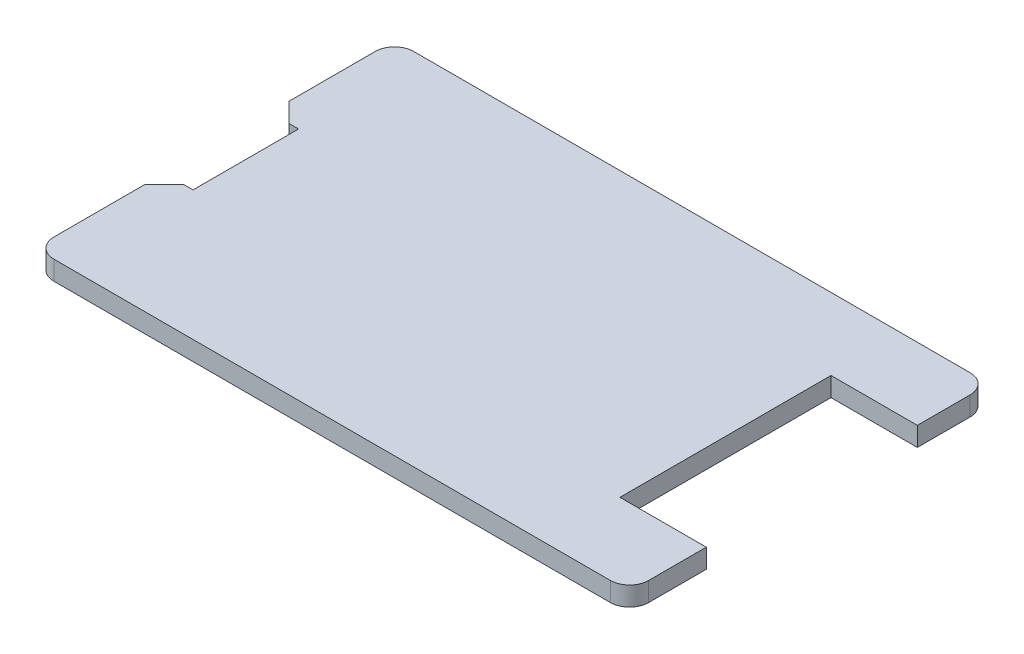
ISO-10303-21;
HEADER;
FILE_DESCRIPTION(('STEP AP214'),'2;1');
FILE_NAME('part.step','',(''),(''),'','','');
FILE_SCHEMA(('AUTOMOTIVE_DESIGN { 1 0 10303 214 1 1 1 1 }'));
ENDSEC;
DATA;
#1=APPLICATION_CONTEXT('core data for automotive mechanical design processes');
#2=APPLICATION_PROTOCOL_DEFINITION('international standard','automotive_design',2000,#1);
#3=PRODUCT_CONTEXT('',#1,'mechanical');
#4=PRODUCT('Part','Part','',(#3));
#5=PRODUCT_RELATED_PRODUCT_CATEGORY('part','',(#4));
#6=PRODUCT_DEFINITION_FORMATION('','',#4);
#7=PRODUCT_DEFINITION_CONTEXT('part definition',#1,'design');
#8=PRODUCT_DEFINITION('design','',#6,#7);
#9=PRODUCT_DEFINITION_SHAPE('','',#8);
#10=(LENGTH_UNIT() NAMED_UNIT(*) SI_UNIT(.MILLI.,.METRE.));
#11=(NAMED_UNIT(*) PLANE_ANGLE_UNIT() SI_UNIT($,.RADIAN.));
#12=(NAMED_UNIT(*) SI_UNIT($,.STERADIAN.) SOLID_ANGLE_UNIT());
#13=UNCERTAINTY_MEASURE_WITH_UNIT(LENGTH_MEASURE(1.E-05),#10,'distance_accuracy_value','');
#14=(GEOMETRIC_REPRESENTATION_CONTEXT(3) GLOBAL_UNCERTAINTY_ASSIGNED_CONTEXT((#13)) GLOBAL_UNIT_ASSIGNED_CONTEXT((#10,
#11,#12)) REPRESENTATION_CONTEXT('',''));
#15=CARTESIAN_POINT('',(0.,0.,0.));
#16=DIRECTION('',(0.,0.,1.));
#17=DIRECTION('',(1.,0.,0.));
#18=AXIS2_PLACEMENT_3D('',#15,#16,#17);
#19=CARTESIAN_POINT('',(30.75,2.,22.8489425981873));
#20=DIRECTION('',(-1.,0.,0.));
#21=DIRECTION('',(0.,0.,1.));
#22=AXIS2_PLACEMENT_3D('',#19,#20,#21);
#23=PLANE('',#22);
#24=DIRECTION('',(0.,0.,-1.));
#25=VECTOR('',#24,1.);
#26=CARTESIAN_POINT('',(30.75,0.,22.8489425981873));
#27=LINE('',#26,#25);
#28=CARTESIAN_POINT('',(30.75,0.,22.8489425981873));
#29=VERTEX_POINT('',#28);
#30=CARTESIAN_POINT('',(30.75,0.,16.8489425981873));
#31=VERTEX_POINT('',#30);
#32=EDGE_CURVE('E184',#29,#31,#27,.T.);
#33=ORIENTED_EDGE('',*,*,#32,.T.);
#34=DIRECTION('',(0.,1.,0.));
#35=VECTOR('',#34,1.);
#36=CARTESIAN_POINT('',(30.75,0.,16.8489425981873));
#37=LINE('',#36,#35);
#38=CARTESIAN_POINT('',(30.75,2.,16.8489425981873));
#39=VERTEX_POINT('',#38);
#40=EDGE_CURVE('E275',#31,#39,#37,.T.);
#41=ORIENTED_EDGE('',*,*,#40,.T.);
#42=DIRECTION('',(0.,0.,-1.));
#43=VECTOR('',#42,1.);
#44=CARTESIAN_POINT('',(30.75,2.,22.8489425981873));
#45=LINE('',#44,#43);
#46=CARTESIAN_POINT('',(30.75,2.,22.8489425981873));
#47=VERTEX_POINT('',#46);
#48=EDGE_CURVE('E276',#47,#39,#45,.T.);
#49=ORIENTED_EDGE('',*,*,#48,.F.);
#50=DIRECTION('',(0.,-1.,0.));
#51=VECTOR('',#50,1.);
#52=CARTESIAN_POINT('',(30.75,2.,22.8489425981873));
#53=LINE('',#52,#51);
#54=EDGE_CURVE('E216',#47,#29,#53,.T.);
#55=ORIENTED_EDGE('',*,*,#54,.T.);
#56=EDGE_LOOP('',(#33,#41,#49,#55));
#57=FACE_BOUND('',#56,.T.);
#58=ADVANCED_FACE('F35',(#57),#23,.F.);
#59=CARTESIAN_POINT('',(-31.25,2.,22.8489425981873));
#60=DIRECTION('',(1.,0.,0.));
#61=DIRECTION('',(0.,0.,-1.));
#62=AXIS2_PLACEMENT_3D('',#59,#60,#61);
#63=PLANE('',#62);
#64=DIRECTION('',(0.,0.,1.));
#65=VECTOR('',#64,1.);
#66=CARTESIAN_POINT('',(-31.25,0.,22.8489425981873));
#67=LINE('',#66,#65);
#68=CARTESIAN_POINT('',(-31.25,0.,-10.6510574018127));
#69=VERTEX_POINT('',#68);
#70=CARTESIAN_POINT('',(-31.25,0.,-1.6510574018127));
#71=VERTEX_POINT('',#70);
#72=EDGE_CURVE('E198',#69,#71,#67,.T.);
#73=ORIENTED_EDGE('',*,*,#72,.T.);
#74=DIRECTION('',(0.,1.,0.));
#75=VECTOR('',#74,1.);
#76=CARTESIAN_POINT('',(-31.25,2.,-1.6510574018127));
#77=LINE('',#76,#75);
#78=CARTESIAN_POINT('',(-31.25,2.,-1.6510574018127));
#79=VERTEX_POINT('',#78);
#80=EDGE_CURVE('E43',#71,#79,#77,.T.);
#81=ORIENTED_EDGE('',*,*,#80,.T.);
#82=DIRECTION('',(0.,0.,1.));
#83=VECTOR('',#82,1.);
#84=CARTESIAN_POINT('',(-31.25,2.,22.8489425981873));
#85=LINE('',#84,#83);
#86=CARTESIAN_POINT('',(-31.25,2.,-10.6510574018127));
#87=VERTEX_POINT('',#86);
#88=EDGE_CURVE('E205',#87,#79,#85,.T.);
#89=ORIENTED_EDGE('',*,*,#88,.F.);
#90=DIRECTION('',(0.,-1.,0.));
#91=VECTOR('',#90,1.);
#92=CARTESIAN_POINT('',(-31.25,2.,-10.6510574018127));
#93=LINE('',#92,#91);
#94=EDGE_CURVE('E204',#87,#69,#93,.T.);
#95=ORIENTED_EDGE('',*,*,#94,.T.);
#96=EDGE_LOOP('',(#73,#81,#89,#95));
#97=FACE_BOUND('',#96,.T.);
#98=ADVANCED_FACE('F241',(#97),#63,.F.);
#99=CARTESIAN_POINT('',(-29.25,2.,22.8489425981873));
#100=DIRECTION('',(0.,-1.,0.));
#101=DIRECTION('',(0.,0.,-1.));
#102=AXIS2_PLACEMENT_3D('',#99,#100,#101);
#103=CYLINDRICAL_SURFACE('',#102,2.);
#104=CARTESIAN_POINT('',(-29.25,0.,22.8489425981873));
#105=DIRECTION('',(0.,1.,0.));
#106=DIRECTION('',(0.,0.,-1.));
#107=AXIS2_PLACEMENT_3D('',#104,#105,#106);
#108=CIRCLE('',#107,2.);
#109=CARTESIAN_POINT('',(-31.25,0.,22.8489425981873));
#110=VERTEX_POINT('',#109);
#111=CARTESIAN_POINT('',(-29.25,0.,24.8489425981873));
#112=VERTEX_POINT('',#111);
#113=EDGE_CURVE('E256',#110,#112,#108,.T.);
#114=ORIENTED_EDGE('',*,*,#113,.T.);
#115=DIRECTION('',(0.,-1.,0.));
#116=VECTOR('',#115,1.);
#117=CARTESIAN_POINT('',(-29.25,2.,24.8489425981873));
#118=LINE('',#117,#116);
#119=CARTESIAN_POINT('',(-29.25,2.,24.8489425981873));
#120=VERTEX_POINT('',#119);
#121=EDGE_CURVE('E222',#120,#112,#118,.T.);
#122=ORIENTED_EDGE('',*,*,#121,.F.);
#123=CARTESIAN_POINT('',(-29.25,2.,22.8489425981873));
#124=DIRECTION('',(0.,1.,0.));
#125=DIRECTION('',(0.,0.,-1.));
#126=AXIS2_PLACEMENT_3D('',#123,#124,#125);
#127=CIRCLE('',#126,2.);
#128=CARTESIAN_POINT('',(-31.25,2.,22.8489425981873));
#129=VERTEX_POINT('',#128);
#130=EDGE_CURVE('E200',#129,#120,#127,.T.);
#131=ORIENTED_EDGE('',*,*,#130,.F.);
#132=DIRECTION('',(0.,-1.,0.));
#133=VECTOR('',#132,1.);
#134=CARTESIAN_POINT('',(-31.25,2.,22.8489425981873));
#135=LINE('',#134,#133);
#136=EDGE_CURVE('E201',#129,#110,#135,.T.);
#137=ORIENTED_EDGE('',*,*,#136,.T.);
#138=EDGE_LOOP('',(#114,#122,#131,#137));
#139=FACE_BOUND('',#138,.T.);
#140=ADVANCED_FACE('F309',(#139),#103,.T.);
#141=CARTESIAN_POINT('',(-29.25,2.,24.8489425981873));
#142=DIRECTION('',(0.,0.,-1.));
#143=DIRECTION('',(-1.,0.,0.));
#144=AXIS2_PLACEMENT_3D('',#141,#142,#143);
#145=PLANE('',#144);
#146=DIRECTION('',(1.,0.,0.));
#147=VECTOR('',#146,1.);
#148=CARTESIAN_POINT('',(-29.25,0.,24.8489425981873));
#149=LINE('',#148,#147);
#150=CARTESIAN_POINT('',(28.75,0.,24.8489425981873));
#151=VERTEX_POINT('',#150);
#152=EDGE_CURVE('E188',#112,#151,#149,.T.);
#153=ORIENTED_EDGE('',*,*,#152,.T.);
#154=DIRECTION('',(0.,-1.,0.));
#155=VECTOR('',#154,1.);
#156=CARTESIAN_POINT('',(28.75,2.,24.8489425981873));
#157=LINE('',#156,#155);
#158=CARTESIAN_POINT('',(28.75,2.,24.8489425981873));
#159=VERTEX_POINT('',#158);
#160=EDGE_CURVE('E219',#159,#151,#157,.T.);
#161=ORIENTED_EDGE('',*,*,#160,.F.);
#162=DIRECTION('',(1.,0.,0.));
#163=VECTOR('',#162,1.);
#164=CARTESIAN_POINT('',(-29.25,2.,24.8489425981873));
#165=LINE('',#164,#163);
#166=EDGE_CURVE('E366',#120,#159,#165,.T.);
#167=ORIENTED_EDGE('',*,*,#166,.F.);
#168=ORIENTED_EDGE('',*,*,#121,.T.);
#169=EDGE_LOOP('',(#153,#161,#167,#168));
#170=FACE_BOUND('',#169,.T.);
#171=ADVANCED_FACE('F261',(#170),#145,.F.);
#172=CARTESIAN_POINT('',(28.75,2.,22.8489425981873));
#173=DIRECTION('',(0.,-1.,0.));
#174=DIRECTION('',(0.,0.,-1.));
#175=AXIS2_PLACEMENT_3D('',#172,#173,#174);
#176=CYLINDRICAL_SURFACE('',#175,2.);
#177=CARTESIAN_POINT('',(28.75,0.,22.8489425981873));
#178=DIRECTION('',(0.,1.,0.));
#179=DIRECTION('',(0.,0.,1.));
#180=AXIS2_PLACEMENT_3D('',#177,#178,#179);
#181=CIRCLE('',#180,2.);
#182=EDGE_CURVE('E185',#151,#29,#181,.T.);
#183=ORIENTED_EDGE('',*,*,#182,.T.);
#184=ORIENTED_EDGE('',*,*,#54,.F.);
#185=CARTESIAN_POINT('',(28.75,2.,22.8489425981873));
#186=DIRECTION('',(0.,1.,0.));
#187=DIRECTION('',(0.,0.,1.));
#188=AXIS2_PLACEMENT_3D('',#185,#186,#187);
#189=CIRCLE('',#188,2.);
#190=EDGE_CURVE('E269',#159,#47,#189,.T.);
#191=ORIENTED_EDGE('',*,*,#190,.F.);
#192=ORIENTED_EDGE('',*,*,#160,.T.);
#193=EDGE_LOOP('',(#183,#184,#191,#192));
#194=FACE_BOUND('',#193,.T.);
#195=ADVANCED_FACE('F267',(#194),#176,.T.);
#196=CARTESIAN_POINT('',(30.75,2.,-5.15105740181269));
#197=VERTEX_POINT('',#196);
#198=CARTESIAN_POINT('',(30.75,2.,-10.6510574018127));
#199=VERTEX_POINT('',#198);
#200=EDGE_CURVE('E176',#197,#199,#45,.T.);
#201=ORIENTED_EDGE('',*,*,#200,.F.);
#202=DIRECTION('',(0.,1.,0.));
#203=VECTOR('',#202,1.);
#204=CARTESIAN_POINT('',(30.75,0.,-5.15105740181269));
#205=LINE('',#204,#203);
#206=CARTESIAN_POINT('',(30.75,0.,-5.15105740181269));
#207=VERTEX_POINT('',#206);
#208=EDGE_CURVE('E164',#207,#197,#205,.T.);
#209=ORIENTED_EDGE('',*,*,#208,.F.);
#210=CARTESIAN_POINT('',(30.75,0.,-10.6510574018127));
#211=VERTEX_POINT('',#210);
#212=EDGE_CURVE('E174',#207,#211,#27,.T.);
#213=ORIENTED_EDGE('',*,*,#212,.T.);
#214=DIRECTION('',(0.,-1.,0.));
#215=VECTOR('',#214,1.);
#216=CARTESIAN_POINT('',(30.75,2.,-10.6510574018127));
#217=LINE('',#216,#215);
#218=EDGE_CURVE('E214',#199,#211,#217,.T.);
#219=ORIENTED_EDGE('',*,*,#218,.F.);
#220=EDGE_LOOP('',(#201,#209,#213,#219));
#221=FACE_BOUND('',#220,.T.);
#222=ADVANCED_FACE('F172',(#221),#23,.F.);
#223=CARTESIAN_POINT('',(28.75,2.,-10.6510574018127));
#224=DIRECTION('',(0.,-1.,0.));
#225=DIRECTION('',(0.,0.,-1.));
#226=AXIS2_PLACEMENT_3D('',#223,#224,#225);
#227=CYLINDRICAL_SURFACE('',#226,2.);
#228=CARTESIAN_POINT('',(28.75,0.,-10.6510574018127));
#229=DIRECTION('',(0.,1.,0.));
#230=DIRECTION('',(0.,0.,-1.));
#231=AXIS2_PLACEMENT_3D('',#228,#229,#230);
#232=CIRCLE('',#231,2.);
#233=CARTESIAN_POINT('',(28.75,0.,-12.6510574018127));
#234=VERTEX_POINT('',#233);
#235=EDGE_CURVE('E183',#211,#234,#232,.T.);
#236=ORIENTED_EDGE('',*,*,#235,.T.);
#237=DIRECTION('',(0.,-1.,0.));
#238=VECTOR('',#237,1.);
#239=CARTESIAN_POINT('',(28.75,2.,-12.6510574018127));
#240=LINE('',#239,#238);
#241=CARTESIAN_POINT('',(28.75,2.,-12.6510574018127));
#242=VERTEX_POINT('',#241);
#243=EDGE_CURVE('E211',#242,#234,#240,.T.);
#244=ORIENTED_EDGE('',*,*,#243,.F.);
#245=CARTESIAN_POINT('',(28.75,2.,-10.6510574018127));
#246=DIRECTION('',(0.,1.,0.));
#247=DIRECTION('',(0.,0.,-1.));
#248=AXIS2_PLACEMENT_3D('',#245,#246,#247);
#249=CIRCLE('',#248,2.);
#250=EDGE_CURVE('E278',#199,#242,#249,.T.);
#251=ORIENTED_EDGE('',*,*,#250,.F.);
#252=ORIENTED_EDGE('',*,*,#218,.T.);
#253=EDGE_LOOP('',(#236,#244,#251,#252));
#254=FACE_BOUND('',#253,.T.);
#255=ADVANCED_FACE('F302',(#254),#227,.T.);
#256=CARTESIAN_POINT('',(-29.25,2.,-12.6510574018127));
#257=DIRECTION('',(0.,0.,1.));
#258=DIRECTION('',(1.,0.,0.));
#259=AXIS2_PLACEMENT_3D('',#256,#257,#258);
#260=PLANE('',#259);
#261=DIRECTION('',(-1.,0.,0.));
#262=VECTOR('',#261,1.);
#263=CARTESIAN_POINT('',(-29.25,0.,-12.6510574018127));
#264=LINE('',#263,#262);
#265=CARTESIAN_POINT('',(-29.25,0.,-12.6510574018127));
#266=VERTEX_POINT('',#265);
#267=EDGE_CURVE('E193',#234,#266,#264,.T.);
#268=ORIENTED_EDGE('',*,*,#267,.T.);
#269=DIRECTION('',(0.,-1.,0.));
#270=VECTOR('',#269,1.);
#271=CARTESIAN_POINT('',(-29.25,2.,-12.6510574018127));
#272=LINE('',#271,#270);
#273=CARTESIAN_POINT('',(-29.25,2.,-12.6510574018127));
#274=VERTEX_POINT('',#273);
#275=EDGE_CURVE('E208',#274,#266,#272,.T.);
#276=ORIENTED_EDGE('',*,*,#275,.F.);
#277=DIRECTION('',(-1.,0.,0.));
#278=VECTOR('',#277,1.);
#279=CARTESIAN_POINT('',(-29.25,2.,-12.6510574018127));
#280=LINE('',#279,#278);
#281=EDGE_CURVE('E280',#242,#274,#280,.T.);
#282=ORIENTED_EDGE('',*,*,#281,.F.);
#283=ORIENTED_EDGE('',*,*,#243,.T.);
#284=EDGE_LOOP('',(#268,#276,#282,#283));
#285=FACE_BOUND('',#284,.T.);
#286=ADVANCED_FACE('F289',(#285),#260,.F.);
#287=CARTESIAN_POINT('',(-29.25,2.,-10.6510574018127));
#288=DIRECTION('',(0.,-1.,0.));
#289=DIRECTION('',(0.,0.,-1.));
#290=AXIS2_PLACEMENT_3D('',#287,#288,#289);
#291=CYLINDRICAL_SURFACE('',#290,2.);
#292=CARTESIAN_POINT('',(-29.25,0.,-10.6510574018127));
#293=DIRECTION('',(0.,1.,0.));
#294=DIRECTION('',(0.,0.,-1.));
#295=AXIS2_PLACEMENT_3D('',#292,#293,#294);
#296=CIRCLE('',#295,2.);
#297=EDGE_CURVE('E195',#266,#69,#296,.T.);
#298=ORIENTED_EDGE('',*,*,#297,.T.);
#299=ORIENTED_EDGE('',*,*,#94,.F.);
#300=CARTESIAN_POINT('',(-29.25,2.,-10.6510574018127));
#301=DIRECTION('',(0.,1.,0.));
#302=DIRECTION('',(0.,0.,-1.));
#303=AXIS2_PLACEMENT_3D('',#300,#301,#302);
#304=CIRCLE('',#303,2.);
#305=EDGE_CURVE('E249',#274,#87,#304,.T.);
#306=ORIENTED_EDGE('',*,*,#305,.F.);
#307=ORIENTED_EDGE('',*,*,#275,.T.);
#308=EDGE_LOOP('',(#298,#299,#306,#307));
#309=FACE_BOUND('',#308,.T.);
#310=ADVANCED_FACE('F292',(#309),#291,.T.);
#311=CARTESIAN_POINT('',(-31.25,2.,13.3489425981873));
#312=VERTEX_POINT('',#311);
#313=EDGE_CURVE('E251',#312,#129,#85,.T.);
#314=ORIENTED_EDGE('',*,*,#313,.F.);
#315=DIRECTION('',(0.,-1.,0.));
#316=VECTOR('',#315,1.);
#317=CARTESIAN_POINT('',(-31.25,2.,13.3489425981873));
#318=LINE('',#317,#316);
#319=CARTESIAN_POINT('',(-31.25,0.,13.3489425981873));
#320=VERTEX_POINT('',#319);
#321=EDGE_CURVE('E232',#312,#320,#318,.T.);
#322=ORIENTED_EDGE('',*,*,#321,.T.);
#323=EDGE_CURVE('E197',#320,#110,#67,.T.);
#324=ORIENTED_EDGE('',*,*,#323,.T.);
#325=ORIENTED_EDGE('',*,*,#136,.F.);
#326=EDGE_LOOP('',(#314,#322,#324,#325));
#327=FACE_BOUND('',#326,.T.);
#328=ADVANCED_FACE('F294',(#327),#63,.F.);
#329=CARTESIAN_POINT('',(-29.25,2.,22.8489425981873));
#330=DIRECTION('',(0.,-1.,0.));
#331=DIRECTION('',(0.,0.,-1.));
#332=AXIS2_PLACEMENT_3D('',#329,#330,#331);
#333=PLANE('',#332);
#334=ORIENTED_EDGE('',*,*,#48,.T.);
#335=DIRECTION('',(1.,0.,0.));
#336=VECTOR('',#335,1.);
#337=CARTESIAN_POINT('',(30.75,2.,16.8489425981873));
#338=LINE('',#337,#336);
#339=CARTESIAN_POINT('',(21.75,2.,16.8489425981873));
#340=VERTEX_POINT('',#339);
#341=EDGE_CURVE('E168',#340,#39,#338,.T.);
#342=ORIENTED_EDGE('',*,*,#341,.F.);
#343=DIRECTION('',(0.,0.,1.));
#344=VECTOR('',#343,1.);
#345=CARTESIAN_POINT('',(21.75,2.,-5.15105740181269));
#346=LINE('',#345,#344);
#347=CARTESIAN_POINT('',(21.75,2.,-5.15105740181269));
#348=VERTEX_POINT('',#347);
#349=EDGE_CURVE('E428',#348,#340,#346,.T.);
#350=ORIENTED_EDGE('',*,*,#349,.F.);
#351=DIRECTION('',(-1.,0.,0.));
#352=VECTOR('',#351,1.);
#353=CARTESIAN_POINT('',(30.75,2.,-5.15105740181269));
#354=LINE('',#353,#352);
#355=EDGE_CURVE('E430',#197,#348,#354,.T.);
#356=ORIENTED_EDGE('',*,*,#355,.F.);
#357=ORIENTED_EDGE('',*,*,#200,.T.);
#358=ORIENTED_EDGE('',*,*,#250,.T.);
#359=ORIENTED_EDGE('',*,*,#281,.T.);
#360=ORIENTED_EDGE('',*,*,#305,.T.);
#361=ORIENTED_EDGE('',*,*,#88,.T.);
#362=DIRECTION('',(-0.707106781186548,0.,-0.707106781186547));
#363=VECTOR('',#362,1.);
#364=CARTESIAN_POINT('',(-31.25,2.,-1.6510574018127));
#365=LINE('',#364,#363);
#366=CARTESIAN_POINT('',(-29.25,2.,0.348942598187308));
#367=VERTEX_POINT('',#366);
#368=EDGE_CURVE('E228',#79,#367,#365,.F.);
#369=ORIENTED_EDGE('',*,*,#368,.T.);
#370=DIRECTION('',(-1.,0.,0.));
#371=VECTOR('',#370,1.);
#372=CARTESIAN_POINT('',(-31.25,2.,0.348942598187308));
#373=LINE('',#372,#371);
#374=CARTESIAN_POINT('',(-28.25,2.,0.348942598187308));
#375=VERTEX_POINT('',#374);
#376=EDGE_CURVE('E350',#375,#367,#373,.T.);
#377=ORIENTED_EDGE('',*,*,#376,.F.);
#378=DIRECTION('',(0.,0.,-1.));
#379=VECTOR('',#378,1.);
#380=CARTESIAN_POINT('',(-28.25,2.,0.348942598187308));
#381=LINE('',#380,#379);
#382=CARTESIAN_POINT('',(-28.25,2.,11.3489425981873));
#383=VERTEX_POINT('',#382);
#384=EDGE_CURVE('E354',#383,#375,#381,.T.);
#385=ORIENTED_EDGE('',*,*,#384,.F.);
#386=DIRECTION('',(1.,0.,0.));
#387=VECTOR('',#386,1.);
#388=CARTESIAN_POINT('',(-31.25,2.,11.3489425981873));
#389=LINE('',#388,#387);
#390=CARTESIAN_POINT('',(-29.25,2.,11.3489425981873));
#391=VERTEX_POINT('',#390);
#392=EDGE_CURVE('E359',#391,#383,#389,.T.);
#393=ORIENTED_EDGE('',*,*,#392,.F.);
#394=DIRECTION('',(0.707106781186546,0.,-0.707106781186549));
#395=VECTOR('',#394,1.);
#396=CARTESIAN_POINT('',(-29.25,2.,11.3489425981873));
#397=LINE('',#396,#395);
#398=EDGE_CURVE('E230',#391,#312,#397,.F.);
#399=ORIENTED_EDGE('',*,*,#398,.T.);
#400=ORIENTED_EDGE('',*,*,#313,.T.);
#401=ORIENTED_EDGE('',*,*,#130,.T.);
#402=ORIENTED_EDGE('',*,*,#166,.T.);
#403=ORIENTED_EDGE('',*,*,#190,.T.);
#404=EDGE_LOOP('',(#334,#342,#350,#356,#357,#358,#359,#360,#361,#369,#377,#385,#393,#399,#400,
#401,#402,#403));
#405=FACE_BOUND('',#404,.T.);
#406=ADVANCED_FACE('F245',(#405),#333,.F.);
#407=CARTESIAN_POINT('',(-29.25,0.,22.8489425981873));
#408=DIRECTION('',(0.,-1.,0.));
#409=DIRECTION('',(0.,0.,-1.));
#410=AXIS2_PLACEMENT_3D('',#407,#408,#409);
#411=PLANE('',#410);
#412=DIRECTION('',(1.,0.,0.));
#413=VECTOR('',#412,1.);
#414=CARTESIAN_POINT('',(30.75,0.,16.8489425981873));
#415=LINE('',#414,#413);
#416=CARTESIAN_POINT('',(21.75,0.,16.8489425981873));
#417=VERTEX_POINT('',#416);
#418=EDGE_CURVE('E177',#417,#31,#415,.T.);
#419=ORIENTED_EDGE('',*,*,#418,.T.);
#420=ORIENTED_EDGE('',*,*,#32,.F.);
#421=ORIENTED_EDGE('',*,*,#182,.F.);
#422=ORIENTED_EDGE('',*,*,#152,.F.);
#423=ORIENTED_EDGE('',*,*,#113,.F.);
#424=ORIENTED_EDGE('',*,*,#323,.F.);
#425=DIRECTION('',(-0.707106781186546,0.,0.707106781186549));
#426=VECTOR('',#425,1.);
#427=CARTESIAN_POINT('',(-35.,0.,17.0989425981873));
#428=LINE('',#427,#426);
#429=CARTESIAN_POINT('',(-29.25,0.,11.3489425981873));
#430=VERTEX_POINT('',#429);
#431=EDGE_CURVE('E235',#320,#430,#428,.F.);
#432=ORIENTED_EDGE('',*,*,#431,.T.);
#433=DIRECTION('',(1.,0.,0.));
#434=VECTOR('',#433,1.);
#435=CARTESIAN_POINT('',(-31.25,0.,11.3489425981873));
#436=LINE('',#435,#434);
#437=CARTESIAN_POINT('',(-28.25,0.,11.3489425981873));
#438=VERTEX_POINT('',#437);
#439=EDGE_CURVE('E343',#430,#438,#436,.T.);
#440=ORIENTED_EDGE('',*,*,#439,.T.);
#441=DIRECTION('',(0.,0.,-1.));
#442=VECTOR('',#441,1.);
#443=CARTESIAN_POINT('',(-28.25,0.,0.348942598187308));
#444=LINE('',#443,#442);
#445=CARTESIAN_POINT('',(-28.25,0.,0.348942598187308));
#446=VERTEX_POINT('',#445);
#447=EDGE_CURVE('E349',#438,#446,#444,.T.);
#448=ORIENTED_EDGE('',*,*,#447,.T.);
#449=DIRECTION('',(-1.,0.,0.));
#450=VECTOR('',#449,1.);
#451=CARTESIAN_POINT('',(-31.25,0.,0.348942598187308));
#452=LINE('',#451,#450);
#453=CARTESIAN_POINT('',(-29.25,0.,0.348942598187308));
#454=VERTEX_POINT('',#453);
#455=EDGE_CURVE('E352',#446,#454,#452,.T.);
#456=ORIENTED_EDGE('',*,*,#455,.T.);
#457=DIRECTION('',(0.707106781186548,0.,0.707106781186547));
#458=VECTOR('',#457,1.);
#459=CARTESIAN_POINT('',(-18.,0.,11.5989425981873));
#460=LINE('',#459,#458);
#461=EDGE_CURVE('E58',#454,#71,#460,.F.);
#462=ORIENTED_EDGE('',*,*,#461,.T.);
#463=ORIENTED_EDGE('',*,*,#72,.F.);
#464=ORIENTED_EDGE('',*,*,#297,.F.);
#465=ORIENTED_EDGE('',*,*,#267,.F.);
#466=ORIENTED_EDGE('',*,*,#235,.F.);
#467=ORIENTED_EDGE('',*,*,#212,.F.);
#468=DIRECTION('',(-1.,0.,0.));
#469=VECTOR('',#468,1.);
#470=CARTESIAN_POINT('',(30.75,0.,-5.15105740181269));
#471=LINE('',#470,#469);
#472=CARTESIAN_POINT('',(21.75,0.,-5.15105740181269));
#473=VERTEX_POINT('',#472);
#474=EDGE_CURVE('E160',#207,#473,#471,.T.);
#475=ORIENTED_EDGE('',*,*,#474,.T.);
#476=DIRECTION('',(0.,0.,1.));
#477=VECTOR('',#476,1.);
#478=CARTESIAN_POINT('',(21.75,0.,-5.15105740181269));
#479=LINE('',#478,#477);
#480=EDGE_CURVE('E50',#473,#417,#479,.T.);
#481=ORIENTED_EDGE('',*,*,#480,.T.);
#482=EDGE_LOOP('',(#419,#420,#421,#422,#423,#424,#432,#440,#448,#456,#462,#463,#464,#465,#466,
#467,#475,#481));
#483=FACE_BOUND('',#482,.T.);
#484=ADVANCED_FACE('F181',(#483),#411,.T.);
#485=CARTESIAN_POINT('',(-31.25,0.,0.348942598187308));
#486=DIRECTION('',(0.,0.,-1.));
#487=DIRECTION('',(-1.,0.,0.));
#488=AXIS2_PLACEMENT_3D('',#485,#486,#487);
#489=PLANE('',#488);
#490=ORIENTED_EDGE('',*,*,#376,.T.);
#491=DIRECTION('',(0.,-1.,0.));
#492=VECTOR('',#491,1.);
#493=CARTESIAN_POINT('',(-29.25,0.,0.348942598187308));
#494=LINE('',#493,#492);
#495=EDGE_CURVE('E11',#367,#454,#494,.T.);
#496=ORIENTED_EDGE('',*,*,#495,.T.);
#497=ORIENTED_EDGE('',*,*,#455,.F.);
#498=DIRECTION('',(0.,1.,0.));
#499=VECTOR('',#498,1.);
#500=CARTESIAN_POINT('',(-28.25,0.,0.348942598187308));
#501=LINE('',#500,#499);
#502=EDGE_CURVE('E258',#446,#375,#501,.T.);
#503=ORIENTED_EDGE('',*,*,#502,.T.);
#504=EDGE_LOOP('',(#490,#496,#497,#503));
#505=FACE_BOUND('',#504,.T.);
#506=ADVANCED_FACE('F375',(#505),#489,.F.);
#507=CARTESIAN_POINT('',(-28.25,0.,0.348942598187308));
#508=DIRECTION('',(1.,0.,0.));
#509=DIRECTION('',(0.,0.,-1.));
#510=AXIS2_PLACEMENT_3D('',#507,#508,#509);
#511=PLANE('',#510);
#512=ORIENTED_EDGE('',*,*,#384,.T.);
#513=ORIENTED_EDGE('',*,*,#502,.F.);
#514=ORIENTED_EDGE('',*,*,#447,.F.);
#515=DIRECTION('',(0.,1.,0.));
#516=VECTOR('',#515,1.);
#517=CARTESIAN_POINT('',(-28.25,0.,11.3489425981873));
#518=LINE('',#517,#516);
#519=EDGE_CURVE('E348',#438,#383,#518,.T.);
#520=ORIENTED_EDGE('',*,*,#519,.T.);
#521=EDGE_LOOP('',(#512,#513,#514,#520));
#522=FACE_BOUND('',#521,.T.);
#523=ADVANCED_FACE('F334',(#522),#511,.F.);
#524=CARTESIAN_POINT('',(-31.25,0.,11.3489425981873));
#525=DIRECTION('',(0.,0.,1.));
#526=DIRECTION('',(1.,0.,0.));
#527=AXIS2_PLACEMENT_3D('',#524,#525,#526);
#528=PLANE('',#527);
#529=ORIENTED_EDGE('',*,*,#439,.F.);
#530=DIRECTION('',(0.,1.,0.));
#531=VECTOR('',#530,1.);
#532=CARTESIAN_POINT('',(-29.25,0.,11.3489425981873));
#533=LINE('',#532,#531);
#534=EDGE_CURVE('E225',#430,#391,#533,.T.);
#535=ORIENTED_EDGE('',*,*,#534,.T.);
#536=ORIENTED_EDGE('',*,*,#392,.T.);
#537=ORIENTED_EDGE('',*,*,#519,.F.);
#538=EDGE_LOOP('',(#529,#535,#536,#537));
#539=FACE_BOUND('',#538,.T.);
#540=ADVANCED_FACE('F327',(#539),#528,.F.);
#541=CARTESIAN_POINT('',(-29.25,0.,11.3489425981873));
#542=DIRECTION('',(0.707106781186549,0.,0.707106781186546));
#543=DIRECTION('',(0.,1.,0.));
#544=AXIS2_PLACEMENT_3D('',#541,#542,#543);
#545=PLANE('',#544);
#546=ORIENTED_EDGE('',*,*,#431,.F.);
#547=ORIENTED_EDGE('',*,*,#321,.F.);
#548=ORIENTED_EDGE('',*,*,#398,.F.);
#549=ORIENTED_EDGE('',*,*,#534,.F.);
#550=EDGE_LOOP('',(#546,#547,#548,#549));
#551=FACE_BOUND('',#550,.T.);
#552=ADVANCED_FACE('F325',(#551),#545,.F.);
#553=CARTESIAN_POINT('',(-31.25,2.,-1.6510574018127));
#554=DIRECTION('',(0.707106781186547,0.,-0.707106781186548));
#555=DIRECTION('',(0.,1.,0.));
#556=AXIS2_PLACEMENT_3D('',#553,#554,#555);
#557=PLANE('',#556);
#558=ORIENTED_EDGE('',*,*,#461,.F.);
#559=ORIENTED_EDGE('',*,*,#495,.F.);
#560=ORIENTED_EDGE('',*,*,#368,.F.);
#561=ORIENTED_EDGE('',*,*,#80,.F.);
#562=EDGE_LOOP('',(#558,#559,#560,#561));
#563=FACE_BOUND('',#562,.T.);
#564=ADVANCED_FACE('F37',(#563),#557,.F.);
#565=CARTESIAN_POINT('',(30.75,0.,16.8489425981873));
#566=DIRECTION('',(0.,0.,1.));
#567=DIRECTION('',(1.,0.,0.));
#568=AXIS2_PLACEMENT_3D('',#565,#566,#567);
#569=PLANE('',#568);
#570=ORIENTED_EDGE('',*,*,#341,.T.);
#571=ORIENTED_EDGE('',*,*,#40,.F.);
#572=ORIENTED_EDGE('',*,*,#418,.F.);
#573=DIRECTION('',(0.,1.,0.));
#574=VECTOR('',#573,1.);
#575=CARTESIAN_POINT('',(21.75,0.,16.8489425981873));
#576=LINE('',#575,#574);
#577=EDGE_CURVE('E429',#417,#340,#576,.T.);
#578=ORIENTED_EDGE('',*,*,#577,.T.);
#579=EDGE_LOOP('',(#570,#571,#572,#578));
#580=FACE_BOUND('',#579,.T.);
#581=ADVANCED_FACE('F333',(#580),#569,.F.);
#582=CARTESIAN_POINT('',(21.75,0.,-5.15105740181269));
#583=DIRECTION('',(-1.,0.,0.));
#584=DIRECTION('',(0.,0.,1.));
#585=AXIS2_PLACEMENT_3D('',#582,#583,#584);
#586=PLANE('',#585);
#587=ORIENTED_EDGE('',*,*,#349,.T.);
#588=ORIENTED_EDGE('',*,*,#577,.F.);
#589=ORIENTED_EDGE('',*,*,#480,.F.);
#590=DIRECTION('',(0.,1.,0.));
#591=VECTOR('',#590,1.);
#592=CARTESIAN_POINT('',(21.75,0.,-5.15105740181269));
#593=LINE('',#592,#591);
#594=EDGE_CURVE('E166',#473,#348,#593,.T.);
#595=ORIENTED_EDGE('',*,*,#594,.T.);
#596=EDGE_LOOP('',(#587,#588,#589,#595));
#597=FACE_BOUND('',#596,.T.);
#598=ADVANCED_FACE('F406',(#597),#586,.F.);
#599=CARTESIAN_POINT('',(30.75,0.,-5.15105740181269));
#600=DIRECTION('',(0.,0.,-1.));
#601=DIRECTION('',(-1.,0.,0.));
#602=AXIS2_PLACEMENT_3D('',#599,#600,#601);
#603=PLANE('',#602);
#604=ORIENTED_EDGE('',*,*,#355,.T.);
#605=ORIENTED_EDGE('',*,*,#594,.F.);
#606=ORIENTED_EDGE('',*,*,#474,.F.);
#607=ORIENTED_EDGE('',*,*,#208,.T.);
#608=EDGE_LOOP('',(#604,#605,#606,#607));
#609=FACE_BOUND('',#608,.T.);
#610=ADVANCED_FACE('F163',(#609),#603,.F.);
#611=CLOSED_SHELL('',(#58,#98,#140,#171,#195,#222,#255,#286,#310,#328,#406,#484,#506,#523,#540,
#552,#564,#581,#598,#610));
#612=MANIFOLD_SOLID_BREP('B2',#611);
#613=ADVANCED_BREP_SHAPE_REPRESENTATION('',(#18,#612),#14);
#614=SHAPE_DEFINITION_REPRESENTATION(#9,#613);
ENDSEC;
END-ISO-10303-21;
